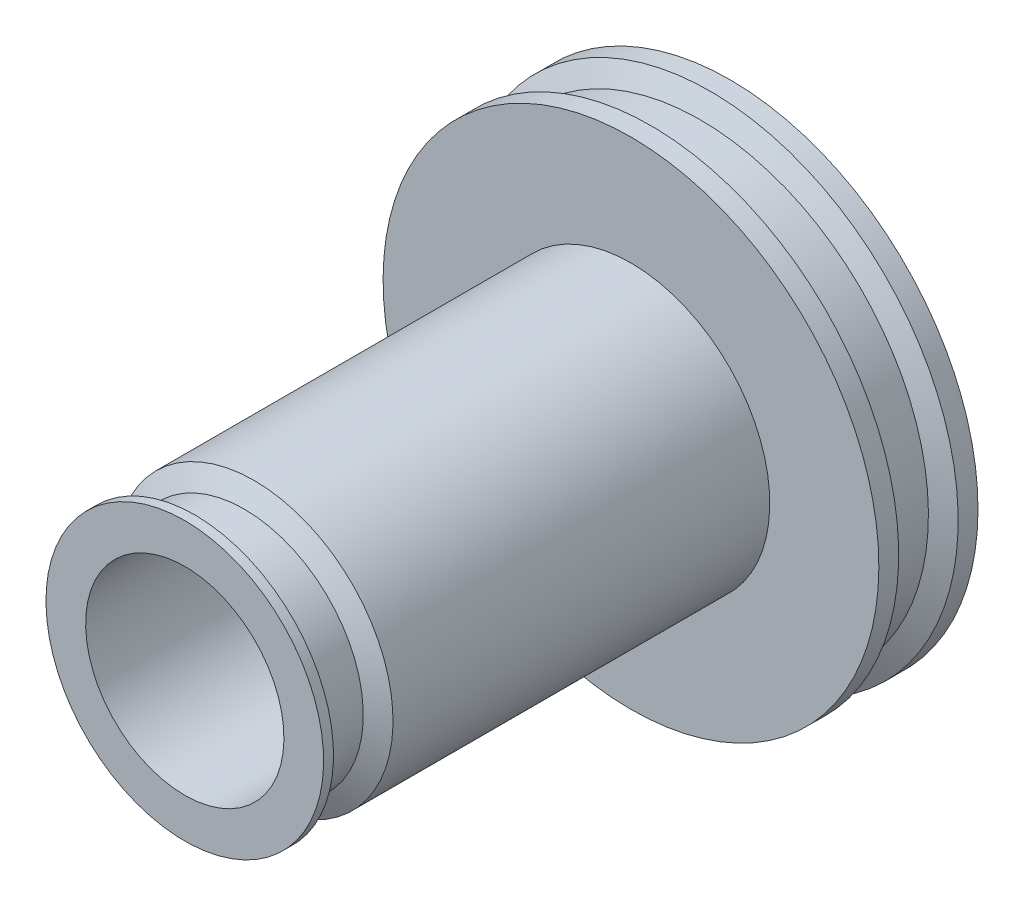
ISO-10303-21;
HEADER;
FILE_DESCRIPTION(('STEP AP214'),'2;1');
FILE_NAME('part.step','',(''),(''),'','','');
FILE_SCHEMA(('AUTOMOTIVE_DESIGN { 1 0 10303 214 1 1 1 1 }'));
ENDSEC;
DATA;
#1=APPLICATION_CONTEXT('core data for automotive mechanical design processes');
#2=APPLICATION_PROTOCOL_DEFINITION('international standard','automotive_design',2000,#1);
#3=PRODUCT_CONTEXT('',#1,'mechanical');
#4=PRODUCT('Part','Part','',(#3));
#5=PRODUCT_RELATED_PRODUCT_CATEGORY('part','',(#4));
#6=PRODUCT_DEFINITION_FORMATION('','',#4);
#7=PRODUCT_DEFINITION_CONTEXT('part definition',#1,'design');
#8=PRODUCT_DEFINITION('design','',#6,#7);
#9=PRODUCT_DEFINITION_SHAPE('','',#8);
#10=(LENGTH_UNIT() NAMED_UNIT(*) SI_UNIT(.MILLI.,.METRE.));
#11=(NAMED_UNIT(*) PLANE_ANGLE_UNIT() SI_UNIT($,.RADIAN.));
#12=(NAMED_UNIT(*) SI_UNIT($,.STERADIAN.) SOLID_ANGLE_UNIT());
#13=UNCERTAINTY_MEASURE_WITH_UNIT(LENGTH_MEASURE(1.E-05),#10,'distance_accuracy_value','');
#14=(GEOMETRIC_REPRESENTATION_CONTEXT(3) GLOBAL_UNCERTAINTY_ASSIGNED_CONTEXT((#13)) GLOBAL_UNIT_ASSIGNED_CONTEXT((#10,
#11,#12)) REPRESENTATION_CONTEXT('',''));
#15=CARTESIAN_POINT('',(0.,0.,0.));
#16=DIRECTION('',(0.,0.,1.));
#17=DIRECTION('',(1.,0.,0.));
#18=AXIS2_PLACEMENT_3D('',#15,#16,#17);
#19=CARTESIAN_POINT('',(60.,0.,-18.5));
#20=DIRECTION('',(0.,0.,-1.));
#21=DIRECTION('',(-0.928726639279647,0.370765194553551,0.));
#22=AXIS2_PLACEMENT_3D('',#19,#20,#21);
#23=CYLINDRICAL_SURFACE('',#22,12.5);
#24=CARTESIAN_POINT('',(60.,0.,-22.5));
#25=DIRECTION('',(0.,0.,-1.));
#26=DIRECTION('',(-0.928726639279647,0.370765194553551,0.));
#27=AXIS2_PLACEMENT_3D('',#24,#25,#26);
#28=CIRCLE('',#27,12.5);
#29=CARTESIAN_POINT('',(48.3909170090044,4.63456493191938,-22.5));
#30=VERTEX_POINT('',#29);
#31=EDGE_CURVE('E60',#30,#30,#28,.T.);
#32=ORIENTED_EDGE('',*,*,#31,.T.);
#33=EDGE_LOOP('',(#32));
#34=FACE_BOUND('',#33,.T.);
#35=CARTESIAN_POINT('',(60.,0.,-23.5));
#36=DIRECTION('',(0.,0.,1.));
#37=DIRECTION('',(0.928726639279647,-0.370765194553551,0.));
#38=AXIS2_PLACEMENT_3D('',#35,#36,#37);
#39=CIRCLE('',#38,12.5);
#40=CARTESIAN_POINT('',(71.6090829909956,-4.63456493191938,-23.5));
#41=VERTEX_POINT('',#40);
#42=EDGE_CURVE('E40',#41,#41,#39,.T.);
#43=ORIENTED_EDGE('',*,*,#42,.T.);
#44=EDGE_LOOP('',(#43));
#45=FACE_BOUND('',#44,.T.);
#46=ADVANCED_FACE('F36',(#34,#45),#23,.T.);
#47=CARTESIAN_POINT('',(60.,0.,-23.5));
#48=DIRECTION('',(0.,0.,1.));
#49=DIRECTION('',(0.928726639279647,-0.370765194553551,0.));
#50=AXIS2_PLACEMENT_3D('',#47,#48,#49);
#51=PLANE('',#50);
#52=ORIENTED_EDGE('',*,*,#42,.F.);
#53=EDGE_LOOP('',(#52));
#54=FACE_BOUND('',#53,.T.);
#55=CARTESIAN_POINT('',(60.,0.,-23.5));
#56=DIRECTION('',(0.,0.,1.));
#57=DIRECTION('',(0.928726639279647,-0.370765194553551,0.));
#58=AXIS2_PLACEMENT_3D('',#55,#56,#57);
#59=CIRCLE('',#58,5.);
#60=CARTESIAN_POINT('',(64.6436331963982,-1.85382597276775,-23.5));
#61=VERTEX_POINT('',#60);
#62=EDGE_CURVE('E47',#61,#61,#59,.T.);
#63=ORIENTED_EDGE('',*,*,#62,.T.);
#64=EDGE_LOOP('',(#63));
#65=FACE_BOUND('',#64,.T.);
#66=ADVANCED_FACE('F101',(#54,#65),#51,.F.);
#67=CARTESIAN_POINT('',(60.,0.,-18.5));
#68=DIRECTION('',(0.,0.,-1.));
#69=DIRECTION('',(-0.928726639279647,0.370765194553551,0.));
#70=AXIS2_PLACEMENT_3D('',#67,#68,#69);
#71=CYLINDRICAL_SURFACE('',#70,5.);
#72=ORIENTED_EDGE('',*,*,#62,.F.);
#73=EDGE_LOOP('',(#72));
#74=FACE_BOUND('',#73,.T.);
#75=CARTESIAN_POINT('',(60.,0.,4.));
#76=DIRECTION('',(0.,0.,1.));
#77=DIRECTION('',(0.928726639279647,-0.370765194553551,0.));
#78=AXIS2_PLACEMENT_3D('',#75,#76,#77);
#79=CIRCLE('',#78,5.);
#80=CARTESIAN_POINT('',(64.6436331963982,-1.85382597276775,4.));
#81=VERTEX_POINT('',#80);
#82=EDGE_CURVE('E55',#81,#81,#79,.T.);
#83=ORIENTED_EDGE('',*,*,#82,.T.);
#84=EDGE_LOOP('',(#83));
#85=FACE_BOUND('',#84,.T.);
#86=ADVANCED_FACE('F106',(#74,#85),#71,.F.);
#87=CARTESIAN_POINT('',(60.,0.,4.));
#88=DIRECTION('',(0.,0.,1.));
#89=DIRECTION('',(0.928726639279647,-0.370765194553551,0.));
#90=AXIS2_PLACEMENT_3D('',#87,#88,#89);
#91=PLANE('',#90);
#92=CARTESIAN_POINT('',(60.,0.,4.));
#93=DIRECTION('',(0.,0.,1.));
#94=DIRECTION('',(0.928726639279647,-0.370765194553551,0.));
#95=AXIS2_PLACEMENT_3D('',#92,#93,#94);
#96=CIRCLE('',#95,7.);
#97=CARTESIAN_POINT('',(53.4989135250425,2.59535636187485,4.));
#98=VERTEX_POINT('',#97);
#99=EDGE_CURVE('E51',#98,#98,#96,.T.);
#100=ORIENTED_EDGE('',*,*,#99,.T.);
#101=EDGE_LOOP('',(#100));
#102=FACE_BOUND('',#101,.T.);
#103=ORIENTED_EDGE('',*,*,#82,.F.);
#104=EDGE_LOOP('',(#103));
#105=FACE_BOUND('',#104,.T.);
#106=ADVANCED_FACE('F116',(#102,#105),#91,.T.);
#107=CARTESIAN_POINT('',(60.,0.,4.));
#108=DIRECTION('',(0.,0.,-1.));
#109=DIRECTION('',(-0.928726639279647,0.370765194553551,0.));
#110=AXIS2_PLACEMENT_3D('',#107,#108,#109);
#111=CYLINDRICAL_SURFACE('',#110,7.);
#112=CARTESIAN_POINT('',(60.,0.,3.5));
#113=DIRECTION('',(0.,0.,-1.));
#114=DIRECTION('',(-0.928726639279647,0.370765194553551,0.));
#115=AXIS2_PLACEMENT_3D('',#112,#113,#114);
#116=CIRCLE('',#115,7.);
#117=CARTESIAN_POINT('',(53.4989135250425,2.59535636187485,3.5));
#118=VERTEX_POINT('',#117);
#119=EDGE_CURVE('E71',#118,#118,#116,.T.);
#120=CARTESIAN_POINT('',(53.4989135250425,2.59535636187485,3.5));
#121=CARTESIAN_POINT('',(53.4989135250425,2.59535636187485,3.50520833333333));
#122=CARTESIAN_POINT('',(53.4989135250425,2.59535636187485,3.51041666666667));
#123=CARTESIAN_POINT('',(53.4989135250425,2.59535636187485,3.52083333333333));
#124=CARTESIAN_POINT('',(53.4989135250425,2.59535636187485,3.52604166666667));
#125=CARTESIAN_POINT('',(53.4989135250425,2.59535636187485,3.53645833333333));
#126=CARTESIAN_POINT('',(53.4989135250425,2.59535636187485,3.54166666666667));
#127=CARTESIAN_POINT('',(53.4989135250425,2.59535636187485,3.55208333333333));
#128=CARTESIAN_POINT('',(53.4989135250425,2.59535636187485,3.55729166666667));
#129=CARTESIAN_POINT('',(53.4989135250425,2.59535636187485,3.56770833333333));
#130=CARTESIAN_POINT('',(53.4989135250425,2.59535636187485,3.57291666666667));
#131=CARTESIAN_POINT('',(53.4989135250425,2.59535636187485,3.58333333333333));
#132=CARTESIAN_POINT('',(53.4989135250425,2.59535636187485,3.58854166666667));
#133=CARTESIAN_POINT('',(53.4989135250425,2.59535636187485,3.59895833333333));
#134=CARTESIAN_POINT('',(53.4989135250425,2.59535636187485,3.60416666666667));
#135=CARTESIAN_POINT('',(53.4989135250425,2.59535636187485,3.61458333333333));
#136=CARTESIAN_POINT('',(53.4989135250425,2.59535636187485,3.61979166666667));
#137=CARTESIAN_POINT('',(53.4989135250425,2.59535636187485,3.63020833333333));
#138=CARTESIAN_POINT('',(53.4989135250425,2.59535636187485,3.63541666666667));
#139=CARTESIAN_POINT('',(53.4989135250425,2.59535636187485,3.64583333333333));
#140=CARTESIAN_POINT('',(53.4989135250425,2.59535636187485,3.65104166666667));
#141=CARTESIAN_POINT('',(53.4989135250425,2.59535636187485,3.66145833333333));
#142=CARTESIAN_POINT('',(53.4989135250425,2.59535636187485,3.66666666666667));
#143=CARTESIAN_POINT('',(53.4989135250425,2.59535636187485,3.67708333333333));
#144=CARTESIAN_POINT('',(53.4989135250425,2.59535636187485,3.68229166666667));
#145=CARTESIAN_POINT('',(53.4989135250425,2.59535636187485,3.69270833333333));
#146=CARTESIAN_POINT('',(53.4989135250425,2.59535636187485,3.69791666666667));
#147=CARTESIAN_POINT('',(53.4989135250425,2.59535636187485,3.70833333333333));
#148=CARTESIAN_POINT('',(53.4989135250425,2.59535636187485,3.71354166666667));
#149=CARTESIAN_POINT('',(53.4989135250425,2.59535636187485,3.72395833333333));
#150=CARTESIAN_POINT('',(53.4989135250425,2.59535636187485,3.72916666666667));
#151=CARTESIAN_POINT('',(53.4989135250425,2.59535636187485,3.73958333333333));
#152=CARTESIAN_POINT('',(53.4989135250425,2.59535636187485,3.74479166666667));
#153=CARTESIAN_POINT('',(53.4989135250425,2.59535636187485,3.75520833333333));
#154=CARTESIAN_POINT('',(53.4989135250425,2.59535636187485,3.76041666666667));
#155=CARTESIAN_POINT('',(53.4989135250425,2.59535636187485,3.77083333333333));
#156=CARTESIAN_POINT('',(53.4989135250425,2.59535636187485,3.77604166666667));
#157=CARTESIAN_POINT('',(53.4989135250425,2.59535636187485,3.78645833333333));
#158=CARTESIAN_POINT('',(53.4989135250425,2.59535636187485,3.79166666666667));
#159=CARTESIAN_POINT('',(53.4989135250425,2.59535636187485,3.80208333333333));
#160=CARTESIAN_POINT('',(53.4989135250425,2.59535636187485,3.80729166666667));
#161=CARTESIAN_POINT('',(53.4989135250425,2.59535636187485,3.81770833333333));
#162=CARTESIAN_POINT('',(53.4989135250425,2.59535636187485,3.82291666666667));
#163=CARTESIAN_POINT('',(53.4989135250425,2.59535636187485,3.83333333333333));
#164=CARTESIAN_POINT('',(53.4989135250425,2.59535636187485,3.83854166666667));
#165=CARTESIAN_POINT('',(53.4989135250425,2.59535636187485,3.84895833333333));
#166=CARTESIAN_POINT('',(53.4989135250425,2.59535636187485,3.85416666666667));
#167=CARTESIAN_POINT('',(53.4989135250425,2.59535636187485,3.86458333333333));
#168=CARTESIAN_POINT('',(53.4989135250425,2.59535636187485,3.86979166666667));
#169=CARTESIAN_POINT('',(53.4989135250425,2.59535636187485,3.88020833333333));
#170=CARTESIAN_POINT('',(53.4989135250425,2.59535636187485,3.88541666666667));
#171=CARTESIAN_POINT('',(53.4989135250425,2.59535636187485,3.89583333333333));
#172=CARTESIAN_POINT('',(53.4989135250425,2.59535636187485,3.90104166666667));
#173=CARTESIAN_POINT('',(53.4989135250425,2.59535636187485,3.91145833333333));
#174=CARTESIAN_POINT('',(53.4989135250425,2.59535636187485,3.91666666666667));
#175=CARTESIAN_POINT('',(53.4989135250425,2.59535636187485,3.92708333333333));
#176=CARTESIAN_POINT('',(53.4989135250425,2.59535636187485,3.93229166666667));
#177=CARTESIAN_POINT('',(53.4989135250425,2.59535636187485,3.94270833333333));
#178=CARTESIAN_POINT('',(53.4989135250425,2.59535636187485,3.94791666666667));
#179=CARTESIAN_POINT('',(53.4989135250425,2.59535636187485,3.95833333333333));
#180=CARTESIAN_POINT('',(53.4989135250425,2.59535636187485,3.96354166666667));
#181=CARTESIAN_POINT('',(53.4989135250425,2.59535636187485,3.97395833333333));
#182=CARTESIAN_POINT('',(53.4989135250425,2.59535636187485,3.97916666666667));
#183=CARTESIAN_POINT('',(53.4989135250425,2.59535636187485,3.98958333333333));
#184=CARTESIAN_POINT('',(53.4989135250425,2.59535636187485,3.99479166666667));
#185=CARTESIAN_POINT('',(53.4989135250425,2.59535636187485,4.));
#186=B_SPLINE_CURVE_WITH_KNOTS('',3,(#120,#121,#122,#123,#124,#125,#126,#127,#128,#129,#130,
#131,#132,#133,#134,#135,#136,#137,#138,#139,#140,#141,#142,#143,#144,#145,#146,#147,#148,#149,
#150,#151,#152,#153,#154,#155,#156,#157,#158,#159,#160,#161,#162,#163,#164,#165,#166,#167,#168,
#169,#170,#171,#172,#173,#174,#175,#176,#177,#178,#179,#180,#181,#182,#183,#184,#185),
.UNSPECIFIED.,.F.,.F.,(4,2,2,2,2,2,2,2,2,2,2,2,2,2,2,2,2,2,2,2,2,2,2,2,2,2,2,2,2,2,2,2,4),(0.,
0.015625,0.03125,0.046875,0.0625000000000001,0.0781250000000001,0.0937500000000001,0.109375,
0.125,0.140625,0.15625,0.171875,0.1875,0.203125,0.21875,0.234375,0.25,0.265625,0.28125,0.296875,
0.3125,0.328125,0.34375,0.359375,0.375,0.390625,0.40625,0.421875000000001,0.437500000000001,
0.453125000000001,0.468750000000001,0.484375000000001,0.500000000000001),.UNSPECIFIED.);
#187=EDGE_CURVE('BSEAM121',#118,#98,#186,.T.);
#188=ORIENTED_EDGE('',*,*,#119,.F.);
#189=ORIENTED_EDGE('',*,*,#99,.F.);
#190=ORIENTED_EDGE('',*,*,#187,.T.);
#191=ORIENTED_EDGE('',*,*,#187,.F.);
#192=EDGE_LOOP('',(#188,#190,#189,#191));
#193=FACE_BOUND('',#192,.T.);
#194=ADVANCED_FACE('F121',(#193),#111,.T.);
#195=CARTESIAN_POINT('',(60.,0.,1.));
#196=DIRECTION('',(0.,0.,-1.));
#197=DIRECTION('',(-0.928726639279647,0.370765194553551,0.));
#198=AXIS2_PLACEMENT_3D('',#195,#196,#197);
#199=CONICAL_SURFACE('',#198,6.,1.10714871779409);
#200=CARTESIAN_POINT('',(60.,0.,0.5));
#201=DIRECTION('',(0.,0.,-1.));
#202=DIRECTION('',(-0.928726639279647,0.370765194553551,0.));
#203=AXIS2_PLACEMENT_3D('',#200,#201,#202);
#204=CIRCLE('',#203,7.);
#205=CARTESIAN_POINT('',(53.4989135250425,2.59535636187485,0.5));
#206=VERTEX_POINT('',#205);
#207=EDGE_CURVE('E61',#206,#206,#204,.T.);
#208=ORIENTED_EDGE('',*,*,#207,.F.);
#209=EDGE_LOOP('',(#208));
#210=FACE_BOUND('',#209,.T.);
#211=CARTESIAN_POINT('',(60.,0.,1.));
#212=DIRECTION('',(0.,0.,-1.));
#213=DIRECTION('',(-0.928726639279647,0.370765194553551,0.));
#214=AXIS2_PLACEMENT_3D('',#211,#212,#213);
#215=CIRCLE('',#214,6.);
#216=CARTESIAN_POINT('',(54.4276401643221,2.2245911673213,1.));
#217=VERTEX_POINT('',#216);
#218=EDGE_CURVE('E65',#217,#217,#215,.T.);
#219=ORIENTED_EDGE('',*,*,#218,.T.);
#220=EDGE_LOOP('',(#219));
#221=FACE_BOUND('',#220,.T.);
#222=ADVANCED_FACE('F127',(#210,#221),#199,.T.);
#223=CARTESIAN_POINT('',(60.,0.,-23.5));
#224=DIRECTION('',(0.,0.,-1.));
#225=DIRECTION('',(-0.928726639279647,0.370765194553551,0.));
#226=AXIS2_PLACEMENT_3D('',#223,#224,#225);
#227=CYLINDRICAL_SURFACE('',#226,6.);
#228=ORIENTED_EDGE('',*,*,#218,.F.);
#229=EDGE_LOOP('',(#228));
#230=FACE_BOUND('',#229,.T.);
#231=CARTESIAN_POINT('',(60.,0.,3.));
#232=DIRECTION('',(0.,0.,-1.));
#233=DIRECTION('',(-0.928726639279647,0.370765194553551,0.));
#234=AXIS2_PLACEMENT_3D('',#231,#232,#233);
#235=CIRCLE('',#234,6.);
#236=CARTESIAN_POINT('',(54.4276401643221,2.2245911673213,3.));
#237=VERTEX_POINT('',#236);
#238=EDGE_CURVE('E68',#237,#237,#235,.T.);
#239=ORIENTED_EDGE('',*,*,#238,.T.);
#240=EDGE_LOOP('',(#239));
#241=FACE_BOUND('',#240,.T.);
#242=ADVANCED_FACE('F97',(#230,#241),#227,.T.);
#243=CARTESIAN_POINT('',(60.,0.,3.5));
#244=DIRECTION('',(0.,0.,1.));
#245=DIRECTION('',(0.928726639279647,-0.370765194553551,0.));
#246=AXIS2_PLACEMENT_3D('',#243,#244,#245);
#247=CONICAL_SURFACE('',#246,7.,1.10714871779409);
#248=ORIENTED_EDGE('',*,*,#238,.F.);
#249=EDGE_LOOP('',(#248));
#250=FACE_BOUND('',#249,.T.);
#251=ORIENTED_EDGE('',*,*,#119,.T.);
#252=EDGE_LOOP('',(#251));
#253=FACE_BOUND('',#252,.T.);
#254=ADVANCED_FACE('F90',(#250,#253),#247,.T.);
#255=CARTESIAN_POINT('',(60.,0.,-19.5));
#256=DIRECTION('',(0.,0.,-1.));
#257=DIRECTION('',(-0.928726639279647,0.370765194553551,0.));
#258=AXIS2_PLACEMENT_3D('',#255,#256,#257);
#259=CIRCLE('',#258,12.5);
#260=CARTESIAN_POINT('',(48.3909170090044,4.63456493191938,-19.5));
#261=VERTEX_POINT('',#260);
#262=EDGE_CURVE('E64',#261,#261,#259,.T.);
#263=ORIENTED_EDGE('',*,*,#262,.F.);
#264=EDGE_LOOP('',(#263));
#265=FACE_BOUND('',#264,.T.);
#266=CARTESIAN_POINT('',(60.,0.,-18.5));
#267=DIRECTION('',(0.,0.,1.));
#268=DIRECTION('',(0.928726639279647,-0.370765194553551,0.));
#269=AXIS2_PLACEMENT_3D('',#266,#267,#268);
#270=CIRCLE('',#269,12.5);
#271=CARTESIAN_POINT('',(71.6090829909956,-4.63456493191938,-18.5));
#272=VERTEX_POINT('',#271);
#273=EDGE_CURVE('E10',#272,#272,#270,.T.);
#274=ORIENTED_EDGE('',*,*,#273,.F.);
#275=EDGE_LOOP('',(#274));
#276=FACE_BOUND('',#275,.T.);
#277=ADVANCED_FACE('F38',(#265,#276),#23,.T.);
#278=CARTESIAN_POINT('',(60.,0.,-18.5));
#279=DIRECTION('',(0.,0.,1.));
#280=DIRECTION('',(0.928726639279647,-0.370765194553551,0.));
#281=AXIS2_PLACEMENT_3D('',#278,#279,#280);
#282=PLANE('',#281);
#283=ORIENTED_EDGE('',*,*,#273,.T.);
#284=EDGE_LOOP('',(#283));
#285=FACE_BOUND('',#284,.T.);
#286=CARTESIAN_POINT('',(60.,0.,-18.5));
#287=DIRECTION('',(0.,0.,1.));
#288=DIRECTION('',(0.928726639279647,-0.370765194553551,0.));
#289=AXIS2_PLACEMENT_3D('',#286,#287,#288);
#290=CIRCLE('',#289,7.);
#291=CARTESIAN_POINT('',(53.4989135250425,2.59535636187485,-18.5));
#292=VERTEX_POINT('',#291);
#293=EDGE_CURVE('E52',#292,#292,#290,.T.);
#294=ORIENTED_EDGE('',*,*,#293,.F.);
#295=EDGE_LOOP('',(#294));
#296=FACE_BOUND('',#295,.T.);
#297=ADVANCED_FACE('F89',(#285,#296),#282,.T.);
#298=CARTESIAN_POINT('',(53.4989135250425,2.59535636187485,0.5));
#299=CARTESIAN_POINT('',(53.4989135250425,2.59535636187485,0.302083333333333));
#300=CARTESIAN_POINT('',(53.4989135250425,2.59535636187485,0.104166666666667));
#301=CARTESIAN_POINT('',(53.4989135250425,2.59535636187485,-0.291666666666667));
#302=CARTESIAN_POINT('',(53.4989135250425,2.59535636187485,-0.489583333333333));
#303=CARTESIAN_POINT('',(53.4989135250425,2.59535636187485,-0.885416666666667));
#304=CARTESIAN_POINT('',(53.4989135250425,2.59535636187485,-1.08333333333333));
#305=CARTESIAN_POINT('',(53.4989135250425,2.59535636187485,-1.47916666666667));
#306=CARTESIAN_POINT('',(53.4989135250425,2.59535636187485,-1.67708333333333));
#307=CARTESIAN_POINT('',(53.4989135250425,2.59535636187485,-2.07291666666667));
#308=CARTESIAN_POINT('',(53.4989135250425,2.59535636187485,-2.27083333333333));
#309=CARTESIAN_POINT('',(53.4989135250425,2.59535636187485,-2.66666666666667));
#310=CARTESIAN_POINT('',(53.4989135250425,2.59535636187485,-2.86458333333333));
#311=CARTESIAN_POINT('',(53.4989135250425,2.59535636187485,-3.26041666666667));
#312=CARTESIAN_POINT('',(53.4989135250425,2.59535636187485,-3.45833333333333));
#313=CARTESIAN_POINT('',(53.4989135250425,2.59535636187485,-3.85416666666667));
#314=CARTESIAN_POINT('',(53.4989135250425,2.59535636187485,-4.05208333333333));
#315=CARTESIAN_POINT('',(53.4989135250425,2.59535636187485,-4.44791666666667));
#316=CARTESIAN_POINT('',(53.4989135250425,2.59535636187485,-4.64583333333333));
#317=CARTESIAN_POINT('',(53.4989135250425,2.59535636187485,-5.04166666666667));
#318=CARTESIAN_POINT('',(53.4989135250425,2.59535636187485,-5.23958333333333));
#319=CARTESIAN_POINT('',(53.4989135250425,2.59535636187485,-5.63541666666667));
#320=CARTESIAN_POINT('',(53.4989135250425,2.59535636187485,-5.83333333333333));
#321=CARTESIAN_POINT('',(53.4989135250425,2.59535636187485,-6.22916666666667));
#322=CARTESIAN_POINT('',(53.4989135250425,2.59535636187485,-6.42708333333333));
#323=CARTESIAN_POINT('',(53.4989135250425,2.59535636187485,-6.82291666666667));
#324=CARTESIAN_POINT('',(53.4989135250425,2.59535636187485,-7.02083333333333));
#325=CARTESIAN_POINT('',(53.4989135250425,2.59535636187485,-7.41666666666667));
#326=CARTESIAN_POINT('',(53.4989135250425,2.59535636187485,-7.61458333333333));
#327=CARTESIAN_POINT('',(53.4989135250425,2.59535636187485,-8.01041666666667));
#328=CARTESIAN_POINT('',(53.4989135250425,2.59535636187485,-8.20833333333334));
#329=CARTESIAN_POINT('',(53.4989135250425,2.59535636187485,-8.60416666666667));
#330=CARTESIAN_POINT('',(53.4989135250425,2.59535636187485,-8.80208333333334));
#331=CARTESIAN_POINT('',(53.4989135250425,2.59535636187485,-9.19791666666667));
#332=CARTESIAN_POINT('',(53.4989135250425,2.59535636187485,-9.39583333333334));
#333=CARTESIAN_POINT('',(53.4989135250425,2.59535636187485,-9.79166666666667));
#334=CARTESIAN_POINT('',(53.4989135250425,2.59535636187485,-9.98958333333334));
#335=CARTESIAN_POINT('',(53.4989135250425,2.59535636187485,-10.3854166666667));
#336=CARTESIAN_POINT('',(53.4989135250425,2.59535636187485,-10.5833333333333));
#337=CARTESIAN_POINT('',(53.4989135250425,2.59535636187485,-10.9791666666667));
#338=CARTESIAN_POINT('',(53.4989135250425,2.59535636187485,-11.1770833333333));
#339=CARTESIAN_POINT('',(53.4989135250425,2.59535636187485,-11.5729166666667));
#340=CARTESIAN_POINT('',(53.4989135250425,2.59535636187485,-11.7708333333333));
#341=CARTESIAN_POINT('',(53.4989135250425,2.59535636187485,-12.1666666666667));
#342=CARTESIAN_POINT('',(53.4989135250425,2.59535636187485,-12.3645833333333));
#343=CARTESIAN_POINT('',(53.4989135250425,2.59535636187485,-12.7604166666667));
#344=CARTESIAN_POINT('',(53.4989135250425,2.59535636187485,-12.9583333333333));
#345=CARTESIAN_POINT('',(53.4989135250425,2.59535636187485,-13.3541666666667));
#346=CARTESIAN_POINT('',(53.4989135250425,2.59535636187485,-13.5520833333333));
#347=CARTESIAN_POINT('',(53.4989135250425,2.59535636187485,-13.9479166666667));
#348=CARTESIAN_POINT('',(53.4989135250425,2.59535636187485,-14.1458333333333));
#349=CARTESIAN_POINT('',(53.4989135250425,2.59535636187485,-14.5416666666667));
#350=CARTESIAN_POINT('',(53.4989135250425,2.59535636187485,-14.7395833333333));
#351=CARTESIAN_POINT('',(53.4989135250425,2.59535636187485,-15.1354166666667));
#352=CARTESIAN_POINT('',(53.4989135250425,2.59535636187485,-15.3333333333333));
#353=CARTESIAN_POINT('',(53.4989135250425,2.59535636187485,-15.7291666666667));
#354=CARTESIAN_POINT('',(53.4989135250425,2.59535636187485,-15.9270833333333));
#355=CARTESIAN_POINT('',(53.4989135250425,2.59535636187485,-16.3229166666667));
#356=CARTESIAN_POINT('',(53.4989135250425,2.59535636187485,-16.5208333333333));
#357=CARTESIAN_POINT('',(53.4989135250425,2.59535636187485,-16.9166666666667));
#358=CARTESIAN_POINT('',(53.4989135250425,2.59535636187485,-17.1145833333333));
#359=CARTESIAN_POINT('',(53.4989135250425,2.59535636187485,-17.5104166666667));
#360=CARTESIAN_POINT('',(53.4989135250425,2.59535636187485,-17.7083333333333));
#361=CARTESIAN_POINT('',(53.4989135250425,2.59535636187485,-18.1041666666667));
#362=CARTESIAN_POINT('',(53.4989135250425,2.59535636187485,-18.3020833333333));
#363=CARTESIAN_POINT('',(53.4989135250425,2.59535636187485,-18.5));
#364=B_SPLINE_CURVE_WITH_KNOTS('',3,(#298,#299,#300,#301,#302,#303,#304,#305,#306,#307,#308,
#309,#310,#311,#312,#313,#314,#315,#316,#317,#318,#319,#320,#321,#322,#323,#324,#325,#326,#327,
#328,#329,#330,#331,#332,#333,#334,#335,#336,#337,#338,#339,#340,#341,#342,#343,#344,#345,#346,
#347,#348,#349,#350,#351,#352,#353,#354,#355,#356,#357,#358,#359,#360,#361,#362,#363),
.UNSPECIFIED.,.F.,.F.,(4,2,2,2,2,2,2,2,2,2,2,2,2,2,2,2,2,2,2,2,2,2,2,2,2,2,2,2,2,2,2,2,4),(0.,
0.59375,1.1875,1.78125,2.375,2.96875,3.5625,4.15625,4.75,5.34375,5.9375,6.53125,7.125,7.71875,
8.3125,8.90625,9.5,10.09375,10.6875,11.28125,11.875,12.46875,13.0625,13.65625,14.25,14.84375,
15.4375,16.03125,16.625,17.21875,17.8125,18.40625,19.),.UNSPECIFIED.);
#365=EDGE_CURVE('BSEAM94',#206,#292,#364,.T.);
#366=ORIENTED_EDGE('',*,*,#207,.T.);
#367=ORIENTED_EDGE('',*,*,#293,.T.);
#368=ORIENTED_EDGE('',*,*,#365,.T.);
#369=ORIENTED_EDGE('',*,*,#365,.F.);
#370=EDGE_LOOP('',(#366,#368,#367,#369));
#371=FACE_BOUND('',#370,.T.);
#372=ADVANCED_FACE('F94',(#371),#111,.T.);
#373=CARTESIAN_POINT('',(60.,0.,-22.));
#374=DIRECTION('',(0.,0.,-1.));
#375=DIRECTION('',(-0.928726639279647,0.370765194553551,0.));
#376=AXIS2_PLACEMENT_3D('',#373,#374,#375);
#377=CONICAL_SURFACE('',#376,11.5,1.10714871779409);
#378=ORIENTED_EDGE('',*,*,#31,.F.);
#379=EDGE_LOOP('',(#378));
#380=FACE_BOUND('',#379,.T.);
#381=CARTESIAN_POINT('',(60.,0.,-22.));
#382=DIRECTION('',(0.,0.,-1.));
#383=DIRECTION('',(-0.928726639279647,0.370765194553551,0.));
#384=AXIS2_PLACEMENT_3D('',#381,#382,#383);
#385=CIRCLE('',#384,11.5);
#386=CARTESIAN_POINT('',(49.3196436482841,4.26379973736583,-22.));
#387=VERTEX_POINT('',#386);
#388=EDGE_CURVE('E76',#387,#387,#385,.T.);
#389=ORIENTED_EDGE('',*,*,#388,.T.);
#390=EDGE_LOOP('',(#389));
#391=FACE_BOUND('',#390,.T.);
#392=ADVANCED_FACE('F137',(#380,#391),#377,.T.);
#393=CARTESIAN_POINT('',(60.,0.,-23.5));
#394=DIRECTION('',(0.,0.,-1.));
#395=DIRECTION('',(-0.928726639279647,0.370765194553551,0.));
#396=AXIS2_PLACEMENT_3D('',#393,#394,#395);
#397=CYLINDRICAL_SURFACE('',#396,11.5);
#398=ORIENTED_EDGE('',*,*,#388,.F.);
#399=EDGE_LOOP('',(#398));
#400=FACE_BOUND('',#399,.T.);
#401=CARTESIAN_POINT('',(60.,0.,-20.));
#402=DIRECTION('',(0.,0.,-1.));
#403=DIRECTION('',(-0.928726639279647,0.370765194553551,0.));
#404=AXIS2_PLACEMENT_3D('',#401,#402,#403);
#405=CIRCLE('',#404,11.5);
#406=CARTESIAN_POINT('',(49.3196436482841,4.26379973736583,-20.));
#407=VERTEX_POINT('',#406);
#408=EDGE_CURVE('E79',#407,#407,#405,.T.);
#409=ORIENTED_EDGE('',*,*,#408,.T.);
#410=EDGE_LOOP('',(#409));
#411=FACE_BOUND('',#410,.T.);
#412=ADVANCED_FACE('F140',(#400,#411),#397,.T.);
#413=CARTESIAN_POINT('',(60.,0.,-19.5));
#414=DIRECTION('',(0.,0.,1.));
#415=DIRECTION('',(0.928726639279647,-0.370765194553551,0.));
#416=AXIS2_PLACEMENT_3D('',#413,#414,#415);
#417=CONICAL_SURFACE('',#416,12.5,1.10714871779409);
#418=ORIENTED_EDGE('',*,*,#408,.F.);
#419=EDGE_LOOP('',(#418));
#420=FACE_BOUND('',#419,.T.);
#421=ORIENTED_EDGE('',*,*,#262,.T.);
#422=EDGE_LOOP('',(#421));
#423=FACE_BOUND('',#422,.T.);
#424=ADVANCED_FACE('F85',(#420,#423),#417,.T.);
#425=CLOSED_SHELL('',(#46,#66,#86,#106,#194,#222,#242,#254,#277,#297,#372,#392,#412,#424));
#426=MANIFOLD_SOLID_BREP('B2',#425);
#427=ADVANCED_BREP_SHAPE_REPRESENTATION('',(#18,#426),#14);
#428=SHAPE_DEFINITION_REPRESENTATION(#9,#427);
ENDSEC;
END-ISO-10303-21;
